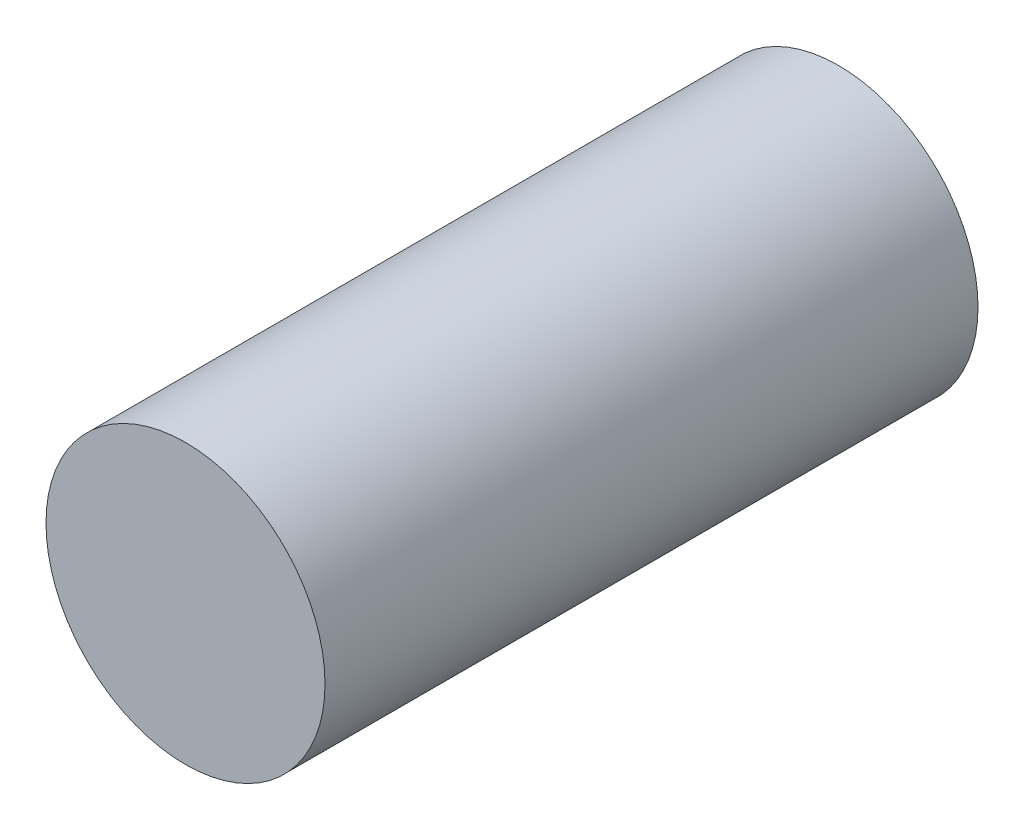
ISO-10303-21;
HEADER;
FILE_DESCRIPTION(('STEP AP214'),'2;1');
FILE_NAME('part.step','',(''),(''),'','','');
FILE_SCHEMA(('AUTOMOTIVE_DESIGN { 1 0 10303 214 1 1 1 1 }'));
ENDSEC;
DATA;
#1=APPLICATION_CONTEXT('core data for automotive mechanical design processes');
#2=APPLICATION_PROTOCOL_DEFINITION('international standard','automotive_design',2000,#1);
#3=PRODUCT_CONTEXT('',#1,'mechanical');
#4=PRODUCT('Part','Part','',(#3));
#5=PRODUCT_RELATED_PRODUCT_CATEGORY('part','',(#4));
#6=PRODUCT_DEFINITION_FORMATION('','',#4);
#7=PRODUCT_DEFINITION_CONTEXT('part definition',#1,'design');
#8=PRODUCT_DEFINITION('design','',#6,#7);
#9=PRODUCT_DEFINITION_SHAPE('','',#8);
#10=(LENGTH_UNIT() NAMED_UNIT(*) SI_UNIT(.MILLI.,.METRE.));
#11=(NAMED_UNIT(*) PLANE_ANGLE_UNIT() SI_UNIT($,.RADIAN.));
#12=(NAMED_UNIT(*) SI_UNIT($,.STERADIAN.) SOLID_ANGLE_UNIT());
#13=UNCERTAINTY_MEASURE_WITH_UNIT(LENGTH_MEASURE(1.E-05),#10,'distance_accuracy_value','');
#14=(GEOMETRIC_REPRESENTATION_CONTEXT(3) GLOBAL_UNCERTAINTY_ASSIGNED_CONTEXT((#13)) GLOBAL_UNIT_ASSIGNED_CONTEXT((#10,
#11,#12)) REPRESENTATION_CONTEXT('',''));
#15=CARTESIAN_POINT('',(0.,0.,0.));
#16=DIRECTION('',(0.,0.,1.));
#17=DIRECTION('',(1.,0.,0.));
#18=AXIS2_PLACEMENT_3D('',#15,#16,#17);
#19=CARTESIAN_POINT('',(400.,0.,26.7936074863071));
#20=DIRECTION('',(0.,0.,-1.));
#21=DIRECTION('',(-1.,0.,0.));
#22=AXIS2_PLACEMENT_3D('',#19,#20,#21);
#23=CYLINDRICAL_SURFACE('',#22,4.70000000000001);
#24=CARTESIAN_POINT('',(400.,0.,-9.5));
#25=DIRECTION('',(0.,0.,1.));
#26=DIRECTION('',(1.,0.,0.));
#27=AXIS2_PLACEMENT_3D('',#24,#25,#26);
#28=CIRCLE('',#27,4.70000000000001);
#29=CARTESIAN_POINT('',(404.7,0.,-9.5));
#30=VERTEX_POINT('',#29);
#31=EDGE_CURVE('E44',#30,#30,#28,.T.);
#32=ORIENTED_EDGE('',*,*,#31,.T.);
#33=EDGE_LOOP('',(#32));
#34=FACE_BOUND('',#33,.T.);
#35=CARTESIAN_POINT('',(400.,0.,12.5));
#36=DIRECTION('',(0.,0.,1.));
#37=DIRECTION('',(1.,0.,0.));
#38=AXIS2_PLACEMENT_3D('',#35,#36,#37);
#39=CIRCLE('',#38,4.70000000000001);
#40=CARTESIAN_POINT('',(404.7,0.,12.5));
#41=VERTEX_POINT('',#40);
#42=EDGE_CURVE('E10',#41,#41,#39,.T.);
#43=ORIENTED_EDGE('',*,*,#42,.F.);
#44=EDGE_LOOP('',(#43));
#45=FACE_BOUND('',#44,.T.);
#46=ADVANCED_FACE('F37',(#34,#45),#23,.T.);
#47=CARTESIAN_POINT('',(400.,0.,-9.5));
#48=DIRECTION('',(0.,0.,1.));
#49=DIRECTION('',(1.,0.,0.));
#50=AXIS2_PLACEMENT_3D('',#47,#48,#49);
#51=PLANE('',#50);
#52=ORIENTED_EDGE('',*,*,#31,.F.);
#53=EDGE_LOOP('',(#52));
#54=FACE_BOUND('',#53,.T.);
#55=ADVANCED_FACE('F52',(#54),#51,.F.);
#56=CARTESIAN_POINT('',(359.399164877961,43.1140602053783,12.5));
#57=DIRECTION('',(0.,0.,1.));
#58=DIRECTION('',(1.,0.,0.));
#59=AXIS2_PLACEMENT_3D('',#56,#57,#58);
#60=PLANE('',#59);
#61=ORIENTED_EDGE('',*,*,#42,.T.);
#62=EDGE_LOOP('',(#61));
#63=FACE_BOUND('',#62,.T.);
#64=ADVANCED_FACE('F39',(#63),#60,.T.);
#65=CLOSED_SHELL('',(#46,#55,#64));
#66=MANIFOLD_SOLID_BREP('B2',#65);
#67=ADVANCED_BREP_SHAPE_REPRESENTATION('',(#18,#66),#14);
#68=SHAPE_DEFINITION_REPRESENTATION(#9,#67);
ENDSEC;
END-ISO-10303-21;
